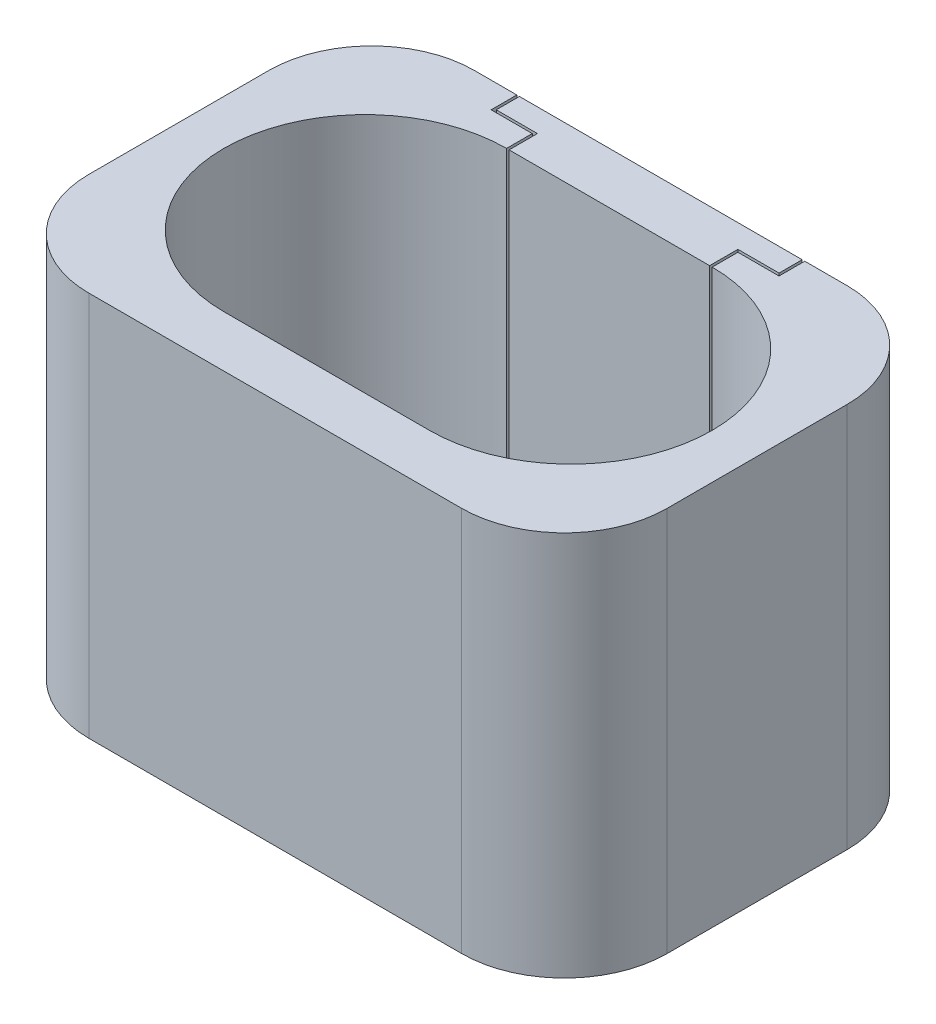
ISO-10303-21;
HEADER;
FILE_DESCRIPTION(('STEP AP214'),'2;1');
FILE_NAME('part.step','',(''),(''),'','','');
FILE_SCHEMA(('AUTOMOTIVE_DESIGN { 1 0 10303 214 1 1 1 1 }'));
ENDSEC;
DATA;
#1=APPLICATION_CONTEXT('core data for automotive mechanical design processes');
#2=APPLICATION_PROTOCOL_DEFINITION('international standard','automotive_design',2000,#1);
#3=PRODUCT_CONTEXT('',#1,'mechanical');
#4=PRODUCT('Part','Part','',(#3));
#5=PRODUCT_RELATED_PRODUCT_CATEGORY('part','',(#4));
#6=PRODUCT_DEFINITION_FORMATION('','',#4);
#7=PRODUCT_DEFINITION_CONTEXT('part definition',#1,'design');
#8=PRODUCT_DEFINITION('design','',#6,#7);
#9=PRODUCT_DEFINITION_SHAPE('','',#8);
#10=(LENGTH_UNIT() NAMED_UNIT(*) SI_UNIT(.MILLI.,.METRE.));
#11=(NAMED_UNIT(*) PLANE_ANGLE_UNIT() SI_UNIT($,.RADIAN.));
#12=(NAMED_UNIT(*) SI_UNIT($,.STERADIAN.) SOLID_ANGLE_UNIT());
#13=UNCERTAINTY_MEASURE_WITH_UNIT(LENGTH_MEASURE(1.E-05),#10,'distance_accuracy_value','');
#14=(GEOMETRIC_REPRESENTATION_CONTEXT(3) GLOBAL_UNCERTAINTY_ASSIGNED_CONTEXT((#13)) GLOBAL_UNIT_ASSIGNED_CONTEXT((#10,
#11,#12)) REPRESENTATION_CONTEXT('',''));
#15=CARTESIAN_POINT('',(0.,0.,0.));
#16=DIRECTION('',(0.,0.,1.));
#17=DIRECTION('',(1.,0.,0.));
#18=AXIS2_PLACEMENT_3D('',#15,#16,#17);
#19=CARTESIAN_POINT('',(-15.15,-7.5,-13.));
#20=DIRECTION('',(0.,0.,1.));
#21=DIRECTION('',(1.,0.,0.));
#22=AXIS2_PLACEMENT_3D('',#19,#20,#21);
#23=PLANE('',#22);
#24=DIRECTION('',(1.,0.,0.));
#25=VECTOR('',#24,1.);
#26=CARTESIAN_POINT('',(-15.15,7.5,-13.));
#27=LINE('',#26,#25);
#28=CARTESIAN_POINT('',(-15.15,7.5,-13.));
#29=VERTEX_POINT('',#28);
#30=CARTESIAN_POINT('',(-7.35,7.5,-13.));
#31=VERTEX_POINT('',#30);
#32=EDGE_CURVE('E124',#29,#31,#27,.T.);
#33=ORIENTED_EDGE('',*,*,#32,.F.);
#34=DIRECTION('',(0.,1.,0.));
#35=VECTOR('',#34,1.);
#36=CARTESIAN_POINT('',(-15.15,-7.5,-13.));
#37=LINE('',#36,#35);
#38=CARTESIAN_POINT('',(-15.15,-7.5,-13.));
#39=VERTEX_POINT('',#38);
#40=EDGE_CURVE('E12',#39,#29,#37,.T.);
#41=ORIENTED_EDGE('',*,*,#40,.F.);
#42=DIRECTION('',(1.,0.,0.));
#43=VECTOR('',#42,1.);
#44=CARTESIAN_POINT('',(-15.15,-7.5,-13.));
#45=LINE('',#44,#43);
#46=CARTESIAN_POINT('',(-7.35,-7.5,-13.));
#47=VERTEX_POINT('',#46);
#48=EDGE_CURVE('E163',#39,#47,#45,.T.);
#49=ORIENTED_EDGE('',*,*,#48,.T.);
#50=DIRECTION('',(0.,1.,0.));
#51=VECTOR('',#50,1.);
#52=CARTESIAN_POINT('',(-7.35,-7.5,-13.));
#53=LINE('',#52,#51);
#54=EDGE_CURVE('E151',#47,#31,#53,.T.);
#55=ORIENTED_EDGE('',*,*,#54,.T.);
#56=EDGE_LOOP('',(#33,#41,#49,#55));
#57=FACE_BOUND('',#56,.T.);
#58=ADVANCED_FACE('F47',(#57),#23,.T.);
#59=CARTESIAN_POINT('',(-15.15,-7.5,-14.1));
#60=DIRECTION('',(-1.,0.,0.));
#61=DIRECTION('',(0.,0.,1.));
#62=AXIS2_PLACEMENT_3D('',#59,#60,#61);
#63=PLANE('',#62);
#64=DIRECTION('',(0.,0.,1.));
#65=VECTOR('',#64,1.);
#66=CARTESIAN_POINT('',(-15.15,7.5,-14.1));
#67=LINE('',#66,#65);
#68=CARTESIAN_POINT('',(-15.15,7.5,-14.1));
#69=VERTEX_POINT('',#68);
#70=EDGE_CURVE('E172',#69,#29,#67,.T.);
#71=ORIENTED_EDGE('',*,*,#70,.F.);
#72=DIRECTION('',(0.,1.,0.));
#73=VECTOR('',#72,1.);
#74=CARTESIAN_POINT('',(-15.15,-7.5,-14.1));
#75=LINE('',#74,#73);
#76=CARTESIAN_POINT('',(-15.15,-7.5,-14.1));
#77=VERTEX_POINT('',#76);
#78=EDGE_CURVE('E57',#77,#69,#75,.T.);
#79=ORIENTED_EDGE('',*,*,#78,.F.);
#80=DIRECTION('',(0.,0.,1.));
#81=VECTOR('',#80,1.);
#82=CARTESIAN_POINT('',(-15.15,-7.5,-14.1));
#83=LINE('',#82,#81);
#84=EDGE_CURVE('E161',#77,#39,#83,.T.);
#85=ORIENTED_EDGE('',*,*,#84,.T.);
#86=ORIENTED_EDGE('',*,*,#40,.T.);
#87=EDGE_LOOP('',(#71,#79,#85,#86));
#88=FACE_BOUND('',#87,.T.);
#89=ADVANCED_FACE('F192',(#88),#63,.T.);
#90=CARTESIAN_POINT('',(-16.75,-7.5,-14.1));
#91=DIRECTION('',(0.,0.,1.));
#92=DIRECTION('',(1.,0.,0.));
#93=AXIS2_PLACEMENT_3D('',#90,#91,#92);
#94=PLANE('',#93);
#95=DIRECTION('',(1.,0.,0.));
#96=VECTOR('',#95,1.);
#97=CARTESIAN_POINT('',(-16.75,7.5,-14.1));
#98=LINE('',#97,#96);
#99=CARTESIAN_POINT('',(-16.75,7.5,-14.1));
#100=VERTEX_POINT('',#99);
#101=EDGE_CURVE('E169',#100,#69,#98,.T.);
#102=ORIENTED_EDGE('',*,*,#101,.F.);
#103=DIRECTION('',(0.,1.,0.));
#104=VECTOR('',#103,1.);
#105=CARTESIAN_POINT('',(-16.75,-7.5,-14.1));
#106=LINE('',#105,#104);
#107=CARTESIAN_POINT('',(-16.75,-7.5,-14.1));
#108=VERTEX_POINT('',#107);
#109=EDGE_CURVE('E175',#108,#100,#106,.T.);
#110=ORIENTED_EDGE('',*,*,#109,.F.);
#111=DIRECTION('',(1.,0.,0.));
#112=VECTOR('',#111,1.);
#113=CARTESIAN_POINT('',(-16.75,-7.5,-14.1));
#114=LINE('',#113,#112);
#115=EDGE_CURVE('E159',#108,#77,#114,.T.);
#116=ORIENTED_EDGE('',*,*,#115,.T.);
#117=ORIENTED_EDGE('',*,*,#78,.T.);
#118=EDGE_LOOP('',(#102,#110,#116,#117));
#119=FACE_BOUND('',#118,.T.);
#120=ADVANCED_FACE('F193',(#119),#94,.T.);
#121=CARTESIAN_POINT('',(-16.75,-7.5,-15.));
#122=DIRECTION('',(-1.,0.,0.));
#123=DIRECTION('',(0.,0.,1.));
#124=AXIS2_PLACEMENT_3D('',#121,#122,#123);
#125=PLANE('',#124);
#126=DIRECTION('',(0.,0.,1.));
#127=VECTOR('',#126,1.);
#128=CARTESIAN_POINT('',(-16.75,7.5,-15.));
#129=LINE('',#128,#127);
#130=CARTESIAN_POINT('',(-16.75,7.5,-15.));
#131=VERTEX_POINT('',#130);
#132=EDGE_CURVE('E166',#131,#100,#129,.T.);
#133=ORIENTED_EDGE('',*,*,#132,.F.);
#134=DIRECTION('',(0.,1.,0.));
#135=VECTOR('',#134,1.);
#136=CARTESIAN_POINT('',(-16.75,-7.5,-15.));
#137=LINE('',#136,#135);
#138=CARTESIAN_POINT('',(-16.75,-7.5,-15.));
#139=VERTEX_POINT('',#138);
#140=EDGE_CURVE('E51',#139,#131,#137,.T.);
#141=ORIENTED_EDGE('',*,*,#140,.F.);
#142=DIRECTION('',(0.,0.,1.));
#143=VECTOR('',#142,1.);
#144=CARTESIAN_POINT('',(-16.75,-7.5,-15.));
#145=LINE('',#144,#143);
#146=EDGE_CURVE('E123',#139,#108,#145,.T.);
#147=ORIENTED_EDGE('',*,*,#146,.T.);
#148=ORIENTED_EDGE('',*,*,#109,.T.);
#149=EDGE_LOOP('',(#133,#141,#147,#148));
#150=FACE_BOUND('',#149,.T.);
#151=ADVANCED_FACE('F178',(#150),#125,.T.);
#152=CARTESIAN_POINT('',(-15.15,-7.5,-15.));
#153=DIRECTION('',(0.,0.,-1.));
#154=DIRECTION('',(-1.,0.,0.));
#155=AXIS2_PLACEMENT_3D('',#152,#153,#154);
#156=PLANE('',#155);
#157=DIRECTION('',(-1.,0.,0.));
#158=VECTOR('',#157,1.);
#159=CARTESIAN_POINT('',(-15.15,7.5,-15.));
#160=LINE('',#159,#158);
#161=CARTESIAN_POINT('',(-5.75000000000001,7.5,-15.));
#162=VERTEX_POINT('',#161);
#163=EDGE_CURVE('E129',#162,#131,#160,.T.);
#164=ORIENTED_EDGE('',*,*,#163,.F.);
#165=DIRECTION('',(0.,1.,0.));
#166=VECTOR('',#165,1.);
#167=CARTESIAN_POINT('',(-5.75000000000001,-7.5,-15.));
#168=LINE('',#167,#166);
#169=CARTESIAN_POINT('',(-5.75000000000001,-7.5,-15.));
#170=VERTEX_POINT('',#169);
#171=EDGE_CURVE('E127',#170,#162,#168,.T.);
#172=ORIENTED_EDGE('',*,*,#171,.F.);
#173=DIRECTION('',(-1.,0.,0.));
#174=VECTOR('',#173,1.);
#175=CARTESIAN_POINT('',(-11.25,-7.5,-15.));
#176=LINE('',#175,#174);
#177=EDGE_CURVE('E91',#170,#139,#176,.T.);
#178=ORIENTED_EDGE('',*,*,#177,.T.);
#179=ORIENTED_EDGE('',*,*,#140,.T.);
#180=EDGE_LOOP('',(#164,#172,#178,#179));
#181=FACE_BOUND('',#180,.T.);
#182=ADVANCED_FACE('F49',(#181),#156,.T.);
#183=CARTESIAN_POINT('',(0.,-7.5,0.));
#184=DIRECTION('',(0.,1.,0.));
#185=DIRECTION('',(0.,0.,1.));
#186=AXIS2_PLACEMENT_3D('',#183,#184,#185);
#187=PLANE('',#186);
#188=ORIENTED_EDGE('',*,*,#177,.F.);
#189=DIRECTION('',(0.,0.,1.));
#190=VECTOR('',#189,1.);
#191=CARTESIAN_POINT('',(-5.75000000000001,-7.5,-15.));
#192=LINE('',#191,#190);
#193=CARTESIAN_POINT('',(-5.75000000000001,-7.5,-14.1));
#194=VERTEX_POINT('',#193);
#195=EDGE_CURVE('E119',#170,#194,#192,.T.);
#196=ORIENTED_EDGE('',*,*,#195,.T.);
#197=DIRECTION('',(-1.,0.,0.));
#198=VECTOR('',#197,1.);
#199=CARTESIAN_POINT('',(-5.75000000000001,-7.5,-14.1));
#200=LINE('',#199,#198);
#201=CARTESIAN_POINT('',(-7.35,-7.5,-14.1));
#202=VERTEX_POINT('',#201);
#203=EDGE_CURVE('E138',#194,#202,#200,.T.);
#204=ORIENTED_EDGE('',*,*,#203,.T.);
#205=DIRECTION('',(0.,0.,1.));
#206=VECTOR('',#205,1.);
#207=CARTESIAN_POINT('',(-7.35,-7.5,-14.1));
#208=LINE('',#207,#206);
#209=EDGE_CURVE('E133',#202,#47,#208,.T.);
#210=ORIENTED_EDGE('',*,*,#209,.T.);
#211=ORIENTED_EDGE('',*,*,#48,.F.);
#212=ORIENTED_EDGE('',*,*,#84,.F.);
#213=ORIENTED_EDGE('',*,*,#115,.F.);
#214=ORIENTED_EDGE('',*,*,#146,.F.);
#215=EDGE_LOOP('',(#188,#196,#204,#210,#211,#212,#213,#214));
#216=FACE_BOUND('',#215,.T.);
#217=ADVANCED_FACE('F117',(#216),#187,.F.);
#218=CARTESIAN_POINT('',(0.,7.5,0.));
#219=DIRECTION('',(0.,1.,0.));
#220=DIRECTION('',(0.,0.,1.));
#221=AXIS2_PLACEMENT_3D('',#218,#219,#220);
#222=PLANE('',#221);
#223=ORIENTED_EDGE('',*,*,#32,.T.);
#224=DIRECTION('',(0.,0.,1.));
#225=VECTOR('',#224,1.);
#226=CARTESIAN_POINT('',(-7.35,7.5,-14.1));
#227=LINE('',#226,#225);
#228=CARTESIAN_POINT('',(-7.35,7.5,-14.1));
#229=VERTEX_POINT('',#228);
#230=EDGE_CURVE('E139',#229,#31,#227,.T.);
#231=ORIENTED_EDGE('',*,*,#230,.F.);
#232=DIRECTION('',(-1.,0.,0.));
#233=VECTOR('',#232,1.);
#234=CARTESIAN_POINT('',(-5.75000000000001,7.5,-14.1));
#235=LINE('',#234,#233);
#236=CARTESIAN_POINT('',(-5.75000000000001,7.5,-14.1));
#237=VERTEX_POINT('',#236);
#238=EDGE_CURVE('E143',#237,#229,#235,.T.);
#239=ORIENTED_EDGE('',*,*,#238,.F.);
#240=DIRECTION('',(0.,0.,1.));
#241=VECTOR('',#240,1.);
#242=CARTESIAN_POINT('',(-5.75000000000001,7.5,-15.));
#243=LINE('',#242,#241);
#244=EDGE_CURVE('E148',#162,#237,#243,.T.);
#245=ORIENTED_EDGE('',*,*,#244,.F.);
#246=ORIENTED_EDGE('',*,*,#163,.T.);
#247=ORIENTED_EDGE('',*,*,#132,.T.);
#248=ORIENTED_EDGE('',*,*,#101,.T.);
#249=ORIENTED_EDGE('',*,*,#70,.T.);
#250=EDGE_LOOP('',(#223,#231,#239,#245,#246,#247,#248,#249));
#251=FACE_BOUND('',#250,.T.);
#252=ADVANCED_FACE('F180',(#251),#222,.T.);
#253=CARTESIAN_POINT('',(-7.35,-7.5,-14.1));
#254=DIRECTION('',(1.,0.,0.));
#255=DIRECTION('',(0.,0.,1.));
#256=AXIS2_PLACEMENT_3D('',#253,#254,#255);
#257=PLANE('',#256);
#258=ORIENTED_EDGE('',*,*,#230,.T.);
#259=ORIENTED_EDGE('',*,*,#54,.F.);
#260=ORIENTED_EDGE('',*,*,#209,.F.);
#261=DIRECTION('',(0.,1.,0.));
#262=VECTOR('',#261,1.);
#263=CARTESIAN_POINT('',(-7.35,-7.5,-14.1));
#264=LINE('',#263,#262);
#265=EDGE_CURVE('E154',#202,#229,#264,.T.);
#266=ORIENTED_EDGE('',*,*,#265,.T.);
#267=EDGE_LOOP('',(#258,#259,#260,#266));
#268=FACE_BOUND('',#267,.T.);
#269=ADVANCED_FACE('F191',(#268),#257,.T.);
#270=CARTESIAN_POINT('',(-5.75000000000001,-7.5,-14.1));
#271=DIRECTION('',(0.,0.,1.));
#272=DIRECTION('',(-1.,0.,0.));
#273=AXIS2_PLACEMENT_3D('',#270,#271,#272);
#274=PLANE('',#273);
#275=ORIENTED_EDGE('',*,*,#238,.T.);
#276=ORIENTED_EDGE('',*,*,#265,.F.);
#277=ORIENTED_EDGE('',*,*,#203,.F.);
#278=DIRECTION('',(0.,1.,0.));
#279=VECTOR('',#278,1.);
#280=CARTESIAN_POINT('',(-5.75000000000001,-7.5,-14.1));
#281=LINE('',#280,#279);
#282=EDGE_CURVE('E132',#194,#237,#281,.T.);
#283=ORIENTED_EDGE('',*,*,#282,.T.);
#284=EDGE_LOOP('',(#275,#276,#277,#283));
#285=FACE_BOUND('',#284,.T.);
#286=ADVANCED_FACE('F184',(#285),#274,.T.);
#287=CARTESIAN_POINT('',(-5.75000000000001,-7.5,-15.));
#288=DIRECTION('',(1.,0.,0.));
#289=DIRECTION('',(0.,0.,1.));
#290=AXIS2_PLACEMENT_3D('',#287,#288,#289);
#291=PLANE('',#290);
#292=ORIENTED_EDGE('',*,*,#244,.T.);
#293=ORIENTED_EDGE('',*,*,#282,.F.);
#294=ORIENTED_EDGE('',*,*,#195,.F.);
#295=ORIENTED_EDGE('',*,*,#171,.T.);
#296=EDGE_LOOP('',(#292,#293,#294,#295));
#297=FACE_BOUND('',#296,.T.);
#298=ADVANCED_FACE('F135',(#297),#291,.T.);
#299=CLOSED_SHELL('',(#58,#89,#120,#151,#182,#217,#252,#269,#286,#298));
#300=MANIFOLD_SOLID_BREP('B2',#299);
#301=CARTESIAN_POINT('',(-22.5,7.5,-15.));
#302=DIRECTION('',(0.,0.,1.));
#303=DIRECTION('',(1.,0.,0.));
#304=AXIS2_PLACEMENT_3D('',#301,#302,#303);
#305=PLANE('',#304);
#306=DIRECTION('',(-1.,0.,0.));
#307=VECTOR('',#306,1.);
#308=CARTESIAN_POINT('',(-22.5,7.5,-15.));
#309=LINE('',#308,#307);
#310=CARTESIAN_POINT('',(-4.00000000000001,7.5,-15.));
#311=VERTEX_POINT('',#310);
#312=CARTESIAN_POINT('',(-5.65000000000001,7.5,-15.));
#313=VERTEX_POINT('',#312);
#314=EDGE_CURVE('E513',#311,#313,#309,.T.);
#315=ORIENTED_EDGE('',*,*,#314,.F.);
#316=DIRECTION('',(0.,-1.,0.));
#317=VECTOR('',#316,1.);
#318=CARTESIAN_POINT('',(-4.,7.5,-15.));
#319=LINE('',#318,#317);
#320=CARTESIAN_POINT('',(-4.00000000000001,-7.5,-15.));
#321=VERTEX_POINT('',#320);
#322=EDGE_CURVE('E517',#311,#321,#319,.T.);
#323=ORIENTED_EDGE('',*,*,#322,.T.);
#324=DIRECTION('',(-1.,0.,0.));
#325=VECTOR('',#324,1.);
#326=CARTESIAN_POINT('',(-22.5,-7.5,-15.));
#327=LINE('',#326,#325);
#328=CARTESIAN_POINT('',(-5.65000000000001,-7.5,-15.));
#329=VERTEX_POINT('',#328);
#330=EDGE_CURVE('E523',#321,#329,#327,.T.);
#331=ORIENTED_EDGE('',*,*,#330,.T.);
#332=DIRECTION('',(0.,1.,0.));
#333=VECTOR('',#332,1.);
#334=CARTESIAN_POINT('',(-5.65000000000001,-7.5,-15.));
#335=LINE('',#334,#333);
#336=EDGE_CURVE('E426',#329,#313,#335,.T.);
#337=ORIENTED_EDGE('',*,*,#336,.T.);
#338=EDGE_LOOP('',(#315,#323,#331,#337));
#339=FACE_BOUND('',#338,.T.);
#340=ADVANCED_FACE('F293',(#339),#305,.F.);
#341=CARTESIAN_POINT('',(0.,7.5,0.));
#342=DIRECTION('',(0.,-1.,0.));
#343=DIRECTION('',(0.,0.,-1.));
#344=AXIS2_PLACEMENT_3D('',#341,#342,#343);
#345=PLANE('',#344);
#346=DIRECTION('',(0.,0.,-1.));
#347=VECTOR('',#346,1.);
#348=CARTESIAN_POINT('',(0.,7.5,-15.));
#349=LINE('',#348,#347);
#350=CARTESIAN_POINT('',(0.,7.5,-4.));
#351=VERTEX_POINT('',#350);
#352=CARTESIAN_POINT('',(0.,7.5,-11.));
#353=VERTEX_POINT('',#352);
#354=EDGE_CURVE('E508',#351,#353,#349,.T.);
#355=ORIENTED_EDGE('',*,*,#354,.T.);
#356=CARTESIAN_POINT('',(-4.,7.5,-11.));
#357=DIRECTION('',(0.,-1.,0.));
#358=DIRECTION('',(0.,0.,-1.));
#359=AXIS2_PLACEMENT_3D('',#356,#357,#358);
#360=CIRCLE('',#359,4.);
#361=EDGE_CURVE('E547',#353,#311,#360,.F.);
#362=ORIENTED_EDGE('',*,*,#361,.T.);
#363=ORIENTED_EDGE('',*,*,#314,.T.);
#364=DIRECTION('',(0.,0.,1.));
#365=VECTOR('',#364,1.);
#366=CARTESIAN_POINT('',(-5.65000000000001,7.5,-15.));
#367=LINE('',#366,#365);
#368=CARTESIAN_POINT('',(-5.65000000000001,7.5,-14.));
#369=VERTEX_POINT('',#368);
#370=EDGE_CURVE('E444',#313,#369,#367,.T.);
#371=ORIENTED_EDGE('',*,*,#370,.T.);
#372=DIRECTION('',(-1.,0.,0.));
#373=VECTOR('',#372,1.);
#374=CARTESIAN_POINT('',(-7.25000000000001,7.5,-14.));
#375=LINE('',#374,#373);
#376=CARTESIAN_POINT('',(-7.25000000000001,7.5,-14.));
#377=VERTEX_POINT('',#376);
#378=EDGE_CURVE('E437',#369,#377,#375,.T.);
#379=ORIENTED_EDGE('',*,*,#378,.T.);
#380=DIRECTION('',(0.,0.,-1.));
#381=VECTOR('',#380,1.);
#382=CARTESIAN_POINT('',(-7.25,7.5,0.000999999999999265));
#383=LINE('',#382,#381);
#384=CARTESIAN_POINT('',(-7.25,7.5,-13.));
#385=VERTEX_POINT('',#384);
#386=EDGE_CURVE('E469',#385,#377,#383,.T.);
#387=ORIENTED_EDGE('',*,*,#386,.F.);
#388=CARTESIAN_POINT('',(-7.25,7.5,-7.5));
#389=DIRECTION('',(0.,1.,0.));
#390=DIRECTION('',(0.,0.,1.));
#391=AXIS2_PLACEMENT_3D('',#388,#389,#390);
#392=CIRCLE('',#391,5.5);
#393=CARTESIAN_POINT('',(-7.25,7.5,-2.));
#394=VERTEX_POINT('',#393);
#395=EDGE_CURVE('E484',#394,#385,#392,.T.);
#396=ORIENTED_EDGE('',*,*,#395,.F.);
#397=DIRECTION('',(1.,0.,0.));
#398=VECTOR('',#397,1.);
#399=CARTESIAN_POINT('',(-15.25,7.5,-2.));
#400=LINE('',#399,#398);
#401=CARTESIAN_POINT('',(-15.25,7.5,-2.));
#402=VERTEX_POINT('',#401);
#403=EDGE_CURVE('E491',#402,#394,#400,.T.);
#404=ORIENTED_EDGE('',*,*,#403,.F.);
#405=CARTESIAN_POINT('',(-15.25,7.5,-7.5));
#406=DIRECTION('',(0.,1.,0.));
#407=DIRECTION('',(0.,0.,1.));
#408=AXIS2_PLACEMENT_3D('',#405,#406,#407);
#409=CIRCLE('',#408,5.5);
#410=CARTESIAN_POINT('',(-15.25,7.5,-13.));
#411=VERTEX_POINT('',#410);
#412=EDGE_CURVE('E472',#411,#402,#409,.T.);
#413=ORIENTED_EDGE('',*,*,#412,.F.);
#414=DIRECTION('',(0.,0.,-1.));
#415=VECTOR('',#414,1.);
#416=CARTESIAN_POINT('',(-15.25,7.5,0.000999999999999265));
#417=LINE('',#416,#415);
#418=CARTESIAN_POINT('',(-15.25,7.5,-14.));
#419=VERTEX_POINT('',#418);
#420=EDGE_CURVE('E473',#411,#419,#417,.T.);
#421=ORIENTED_EDGE('',*,*,#420,.T.);
#422=DIRECTION('',(1.,0.,0.));
#423=VECTOR('',#422,1.);
#424=CARTESIAN_POINT('',(-15.25,7.5,-14.));
#425=LINE('',#424,#423);
#426=CARTESIAN_POINT('',(-16.85,7.5,-14.));
#427=VERTEX_POINT('',#426);
#428=EDGE_CURVE('E456',#427,#419,#425,.T.);
#429=ORIENTED_EDGE('',*,*,#428,.F.);
#430=DIRECTION('',(0.,0.,1.));
#431=VECTOR('',#430,1.);
#432=CARTESIAN_POINT('',(-16.85,7.5,-15.));
#433=LINE('',#432,#431);
#434=CARTESIAN_POINT('',(-16.85,7.5,-15.));
#435=VERTEX_POINT('',#434);
#436=EDGE_CURVE('E449',#435,#427,#433,.T.);
#437=ORIENTED_EDGE('',*,*,#436,.F.);
#438=CARTESIAN_POINT('',(-18.5,7.5,-15.));
#439=VERTEX_POINT('',#438);
#440=EDGE_CURVE('E512',#435,#439,#309,.T.);
#441=ORIENTED_EDGE('',*,*,#440,.T.);
#442=CARTESIAN_POINT('',(-18.5,7.5,-11.));
#443=DIRECTION('',(0.,-1.,0.));
#444=DIRECTION('',(0.,0.,-1.));
#445=AXIS2_PLACEMENT_3D('',#442,#443,#444);
#446=CIRCLE('',#445,4.);
#447=CARTESIAN_POINT('',(-22.5,7.5,-11.));
#448=VERTEX_POINT('',#447);
#449=EDGE_CURVE('E542',#439,#448,#446,.F.);
#450=ORIENTED_EDGE('',*,*,#449,.T.);
#451=DIRECTION('',(0.,0.,1.));
#452=VECTOR('',#451,1.);
#453=CARTESIAN_POINT('',(-22.5,7.5,-15.));
#454=LINE('',#453,#452);
#455=CARTESIAN_POINT('',(-22.5,7.5,-4.));
#456=VERTEX_POINT('',#455);
#457=EDGE_CURVE('E515',#448,#456,#454,.T.);
#458=ORIENTED_EDGE('',*,*,#457,.T.);
#459=CARTESIAN_POINT('',(-18.5,7.5,-4.));
#460=DIRECTION('',(0.,-1.,0.));
#461=DIRECTION('',(0.,0.,-1.));
#462=AXIS2_PLACEMENT_3D('',#459,#460,#461);
#463=CIRCLE('',#462,4.);
#464=CARTESIAN_POINT('',(-18.5,7.5,0.));
#465=VERTEX_POINT('',#464);
#466=EDGE_CURVE('E315',#456,#465,#463,.F.);
#467=ORIENTED_EDGE('',*,*,#466,.T.);
#468=DIRECTION('',(1.,0.,0.));
#469=VECTOR('',#468,1.);
#470=CARTESIAN_POINT('',(-22.5,7.5,0.));
#471=LINE('',#470,#469);
#472=CARTESIAN_POINT('',(-4.00000000000001,7.5,0.));
#473=VERTEX_POINT('',#472);
#474=EDGE_CURVE('E506',#465,#473,#471,.T.);
#475=ORIENTED_EDGE('',*,*,#474,.T.);
#476=CARTESIAN_POINT('',(-4.,7.5,-4.));
#477=DIRECTION('',(0.,-1.,0.));
#478=DIRECTION('',(0.,0.,-1.));
#479=AXIS2_PLACEMENT_3D('',#476,#477,#478);
#480=CIRCLE('',#479,4.);
#481=EDGE_CURVE('E545',#473,#351,#480,.F.);
#482=ORIENTED_EDGE('',*,*,#481,.T.);
#483=EDGE_LOOP('',(#355,#362,#363,#371,#379,#387,#396,#404,#413,#421,#429,#437,#441,#450,#458,
#467,#475,#482));
#484=FACE_BOUND('',#483,.T.);
#485=ADVANCED_FACE('F562',(#484),#345,.F.);
#486=CARTESIAN_POINT('',(0.,-7.5,0.));
#487=DIRECTION('',(0.,-1.,0.));
#488=DIRECTION('',(0.,0.,-1.));
#489=AXIS2_PLACEMENT_3D('',#486,#487,#488);
#490=PLANE('',#489);
#491=ORIENTED_EDGE('',*,*,#330,.F.);
#492=CARTESIAN_POINT('',(-4.,-7.5,-11.));
#493=DIRECTION('',(0.,-1.,0.));
#494=DIRECTION('',(0.,0.,-1.));
#495=AXIS2_PLACEMENT_3D('',#492,#493,#494);
#496=CIRCLE('',#495,4.);
#497=CARTESIAN_POINT('',(0.,-7.5,-11.));
#498=VERTEX_POINT('',#497);
#499=EDGE_CURVE('E535',#321,#498,#496,.T.);
#500=ORIENTED_EDGE('',*,*,#499,.T.);
#501=DIRECTION('',(0.,0.,-1.));
#502=VECTOR('',#501,1.);
#503=CARTESIAN_POINT('',(0.,-7.5,-15.));
#504=LINE('',#503,#502);
#505=CARTESIAN_POINT('',(0.,-7.5,-4.));
#506=VERTEX_POINT('',#505);
#507=EDGE_CURVE('E519',#506,#498,#504,.T.);
#508=ORIENTED_EDGE('',*,*,#507,.F.);
#509=CARTESIAN_POINT('',(-4.,-7.5,-4.));
#510=DIRECTION('',(0.,-1.,0.));
#511=DIRECTION('',(0.,0.,-1.));
#512=AXIS2_PLACEMENT_3D('',#509,#510,#511);
#513=CIRCLE('',#512,4.);
#514=CARTESIAN_POINT('',(-4.00000000000001,-7.5,0.));
#515=VERTEX_POINT('',#514);
#516=EDGE_CURVE('E533',#506,#515,#513,.T.);
#517=ORIENTED_EDGE('',*,*,#516,.T.);
#518=DIRECTION('',(1.,0.,0.));
#519=VECTOR('',#518,1.);
#520=CARTESIAN_POINT('',(-22.5,-7.5,0.));
#521=LINE('',#520,#519);
#522=CARTESIAN_POINT('',(-18.5,-7.5,0.));
#523=VERTEX_POINT('',#522);
#524=EDGE_CURVE('E499',#523,#515,#521,.T.);
#525=ORIENTED_EDGE('',*,*,#524,.F.);
#526=CARTESIAN_POINT('',(-18.5,-7.5,-4.));
#527=DIRECTION('',(0.,-1.,0.));
#528=DIRECTION('',(0.,0.,-1.));
#529=AXIS2_PLACEMENT_3D('',#526,#527,#528);
#530=CIRCLE('',#529,4.);
#531=CARTESIAN_POINT('',(-22.5,-7.5,-4.));
#532=VERTEX_POINT('',#531);
#533=EDGE_CURVE('E531',#523,#532,#530,.T.);
#534=ORIENTED_EDGE('',*,*,#533,.T.);
#535=DIRECTION('',(0.,0.,1.));
#536=VECTOR('',#535,1.);
#537=CARTESIAN_POINT('',(-22.5,-7.5,-15.));
#538=LINE('',#537,#536);
#539=CARTESIAN_POINT('',(-22.5,-7.5,-11.));
#540=VERTEX_POINT('',#539);
#541=EDGE_CURVE('E509',#540,#532,#538,.T.);
#542=ORIENTED_EDGE('',*,*,#541,.F.);
#543=CARTESIAN_POINT('',(-18.5,-7.5,-11.));
#544=DIRECTION('',(0.,-1.,0.));
#545=DIRECTION('',(0.,0.,-1.));
#546=AXIS2_PLACEMENT_3D('',#543,#544,#545);
#547=CIRCLE('',#546,4.);
#548=CARTESIAN_POINT('',(-18.5,-7.5,-15.));
#549=VERTEX_POINT('',#548);
#550=EDGE_CURVE('E529',#540,#549,#547,.T.);
#551=ORIENTED_EDGE('',*,*,#550,.T.);
#552=CARTESIAN_POINT('',(-16.85,-7.5,-15.));
#553=VERTEX_POINT('',#552);
#554=EDGE_CURVE('E522',#553,#549,#327,.T.);
#555=ORIENTED_EDGE('',*,*,#554,.F.);
#556=DIRECTION('',(0.,0.,1.));
#557=VECTOR('',#556,1.);
#558=CARTESIAN_POINT('',(-16.85,-7.5,-15.));
#559=LINE('',#558,#557);
#560=CARTESIAN_POINT('',(-16.85,-7.5,-14.));
#561=VERTEX_POINT('',#560);
#562=EDGE_CURVE('E452',#553,#561,#559,.T.);
#563=ORIENTED_EDGE('',*,*,#562,.T.);
#564=DIRECTION('',(1.,0.,0.));
#565=VECTOR('',#564,1.);
#566=CARTESIAN_POINT('',(-15.25,-7.5,-14.));
#567=LINE('',#566,#565);
#568=CARTESIAN_POINT('',(-15.25,-7.5,-14.));
#569=VERTEX_POINT('',#568);
#570=EDGE_CURVE('E455',#561,#569,#567,.T.);
#571=ORIENTED_EDGE('',*,*,#570,.T.);
#572=DIRECTION('',(0.,0.,-1.));
#573=VECTOR('',#572,1.);
#574=CARTESIAN_POINT('',(-15.25,-7.5,0.000999999999999265));
#575=LINE('',#574,#573);
#576=CARTESIAN_POINT('',(-15.25,-7.5,-13.));
#577=VERTEX_POINT('',#576);
#578=EDGE_CURVE('E476',#577,#569,#575,.T.);
#579=ORIENTED_EDGE('',*,*,#578,.F.);
#580=CARTESIAN_POINT('',(-15.25,-7.5,-7.5));
#581=DIRECTION('',(0.,1.,0.));
#582=DIRECTION('',(0.,0.,1.));
#583=AXIS2_PLACEMENT_3D('',#580,#581,#582);
#584=CIRCLE('',#583,5.5);
#585=CARTESIAN_POINT('',(-15.25,-7.5,-2.));
#586=VERTEX_POINT('',#585);
#587=EDGE_CURVE('E480',#577,#586,#584,.T.);
#588=ORIENTED_EDGE('',*,*,#587,.T.);
#589=DIRECTION('',(1.,0.,0.));
#590=VECTOR('',#589,1.);
#591=CARTESIAN_POINT('',(-15.25,-7.5,-2.));
#592=LINE('',#591,#590);
#593=CARTESIAN_POINT('',(-7.25,-7.5,-2.));
#594=VERTEX_POINT('',#593);
#595=EDGE_CURVE('E483',#586,#594,#592,.T.);
#596=ORIENTED_EDGE('',*,*,#595,.T.);
#597=CARTESIAN_POINT('',(-7.25,-7.5,-7.5));
#598=DIRECTION('',(0.,1.,0.));
#599=DIRECTION('',(0.,0.,1.));
#600=AXIS2_PLACEMENT_3D('',#597,#598,#599);
#601=CIRCLE('',#600,5.5);
#602=CARTESIAN_POINT('',(-7.25,-7.5,-13.));
#603=VERTEX_POINT('',#602);
#604=EDGE_CURVE('E487',#594,#603,#601,.T.);
#605=ORIENTED_EDGE('',*,*,#604,.T.);
#606=DIRECTION('',(0.,0.,-1.));
#607=VECTOR('',#606,1.);
#608=CARTESIAN_POINT('',(-7.25,-7.5,0.000999999999999265));
#609=LINE('',#608,#607);
#610=CARTESIAN_POINT('',(-7.25,-7.5,-14.));
#611=VERTEX_POINT('',#610);
#612=EDGE_CURVE('E443',#603,#611,#609,.T.);
#613=ORIENTED_EDGE('',*,*,#612,.T.);
#614=DIRECTION('',(-1.,0.,0.));
#615=VECTOR('',#614,1.);
#616=CARTESIAN_POINT('',(-7.25000000000001,-7.5,-14.));
#617=LINE('',#616,#615);
#618=CARTESIAN_POINT('',(-5.65000000000001,-7.5,-14.));
#619=VERTEX_POINT('',#618);
#620=EDGE_CURVE('E431',#619,#611,#617,.T.);
#621=ORIENTED_EDGE('',*,*,#620,.F.);
#622=DIRECTION('',(0.,0.,1.));
#623=VECTOR('',#622,1.);
#624=CARTESIAN_POINT('',(-5.65000000000001,-7.5,-15.));
#625=LINE('',#624,#623);
#626=EDGE_CURVE('E419',#329,#619,#625,.T.);
#627=ORIENTED_EDGE('',*,*,#626,.F.);
#628=EDGE_LOOP('',(#491,#500,#508,#517,#525,#534,#542,#551,#555,#563,#571,#579,#588,#596,#605,
#613,#621,#627));
#629=FACE_BOUND('',#628,.T.);
#630=ADVANCED_FACE('F441',(#629),#490,.T.);
#631=CARTESIAN_POINT('',(-7.25,7.5,0.000999999999999265));
#632=DIRECTION('',(1.,0.,0.));
#633=DIRECTION('',(0.,1.,0.));
#634=AXIS2_PLACEMENT_3D('',#631,#632,#633);
#635=PLANE('',#634);
#636=DIRECTION('',(0.,1.,0.));
#637=VECTOR('',#636,1.);
#638=CARTESIAN_POINT('',(-7.25000000000001,-7.5,-14.));
#639=LINE('',#638,#637);
#640=EDGE_CURVE('E430',#611,#377,#639,.T.);
#641=ORIENTED_EDGE('',*,*,#640,.F.);
#642=ORIENTED_EDGE('',*,*,#612,.F.);
#643=DIRECTION('',(0.,1.,0.));
#644=VECTOR('',#643,1.);
#645=CARTESIAN_POINT('',(-7.25,-7.5,-13.));
#646=LINE('',#645,#644);
#647=EDGE_CURVE('E500',#603,#385,#646,.T.);
#648=ORIENTED_EDGE('',*,*,#647,.T.);
#649=ORIENTED_EDGE('',*,*,#386,.T.);
#650=EDGE_LOOP('',(#641,#642,#648,#649));
#651=FACE_BOUND('',#650,.T.);
#652=ADVANCED_FACE('F587',(#651),#635,.F.);
#653=CARTESIAN_POINT('',(-22.5,7.5,0.));
#654=DIRECTION('',(0.,0.,-1.));
#655=DIRECTION('',(-1.,0.,0.));
#656=AXIS2_PLACEMENT_3D('',#653,#654,#655);
#657=PLANE('',#656);
#658=ORIENTED_EDGE('',*,*,#524,.T.);
#659=DIRECTION('',(0.,-1.,0.));
#660=VECTOR('',#659,1.);
#661=CARTESIAN_POINT('',(-4.,7.5,0.));
#662=LINE('',#661,#660);
#663=EDGE_CURVE('E308',#515,#473,#662,.F.);
#664=ORIENTED_EDGE('',*,*,#663,.T.);
#665=ORIENTED_EDGE('',*,*,#474,.F.);
#666=DIRECTION('',(0.,-1.,0.));
#667=VECTOR('',#666,1.);
#668=CARTESIAN_POINT('',(-18.5,7.5,0.));
#669=LINE('',#668,#667);
#670=EDGE_CURVE('E549',#465,#523,#669,.T.);
#671=ORIENTED_EDGE('',*,*,#670,.T.);
#672=EDGE_LOOP('',(#658,#664,#665,#671));
#673=FACE_BOUND('',#672,.T.);
#674=ADVANCED_FACE('F568',(#673),#657,.F.);
#675=CARTESIAN_POINT('',(0.,7.5,-15.));
#676=DIRECTION('',(-1.,0.,0.));
#677=DIRECTION('',(0.,0.,1.));
#678=AXIS2_PLACEMENT_3D('',#675,#676,#677);
#679=PLANE('',#678);
#680=ORIENTED_EDGE('',*,*,#507,.T.);
#681=DIRECTION('',(0.,-1.,0.));
#682=VECTOR('',#681,1.);
#683=CARTESIAN_POINT('',(0.,7.5,-11.));
#684=LINE('',#683,#682);
#685=EDGE_CURVE('E540',#498,#353,#684,.F.);
#686=ORIENTED_EDGE('',*,*,#685,.T.);
#687=ORIENTED_EDGE('',*,*,#354,.F.);
#688=DIRECTION('',(0.,-1.,0.));
#689=VECTOR('',#688,1.);
#690=CARTESIAN_POINT('',(0.,7.5,-4.));
#691=LINE('',#690,#689);
#692=EDGE_CURVE('E537',#351,#506,#691,.T.);
#693=ORIENTED_EDGE('',*,*,#692,.T.);
#694=EDGE_LOOP('',(#680,#686,#687,#693));
#695=FACE_BOUND('',#694,.T.);
#696=ADVANCED_FACE('F576',(#695),#679,.F.);
#697=ORIENTED_EDGE('',*,*,#554,.T.);
#698=DIRECTION('',(0.,-1.,0.));
#699=VECTOR('',#698,1.);
#700=CARTESIAN_POINT('',(-18.5,7.5,-15.));
#701=LINE('',#700,#699);
#702=EDGE_CURVE('E45',#549,#439,#701,.F.);
#703=ORIENTED_EDGE('',*,*,#702,.T.);
#704=ORIENTED_EDGE('',*,*,#440,.F.);
#705=DIRECTION('',(0.,1.,0.));
#706=VECTOR('',#705,1.);
#707=CARTESIAN_POINT('',(-16.85,-7.5,-15.));
#708=LINE('',#707,#706);
#709=EDGE_CURVE('E459',#553,#435,#708,.T.);
#710=ORIENTED_EDGE('',*,*,#709,.F.);
#711=EDGE_LOOP('',(#697,#703,#704,#710));
#712=FACE_BOUND('',#711,.T.);
#713=ADVANCED_FACE('F614',(#712),#305,.F.);
#714=CARTESIAN_POINT('',(-22.5,7.5,-15.));
#715=DIRECTION('',(1.,0.,0.));
#716=DIRECTION('',(0.,0.,-1.));
#717=AXIS2_PLACEMENT_3D('',#714,#715,#716);
#718=PLANE('',#717);
#719=ORIENTED_EDGE('',*,*,#541,.T.);
#720=DIRECTION('',(0.,-1.,0.));
#721=VECTOR('',#720,1.);
#722=CARTESIAN_POINT('',(-22.5,7.5,-4.));
#723=LINE('',#722,#721);
#724=EDGE_CURVE('E301',#532,#456,#723,.F.);
#725=ORIENTED_EDGE('',*,*,#724,.T.);
#726=ORIENTED_EDGE('',*,*,#457,.F.);
#727=DIRECTION('',(0.,-1.,0.));
#728=VECTOR('',#727,1.);
#729=CARTESIAN_POINT('',(-22.5,7.5,-11.));
#730=LINE('',#729,#728);
#731=EDGE_CURVE('E553',#448,#540,#730,.T.);
#732=ORIENTED_EDGE('',*,*,#731,.T.);
#733=EDGE_LOOP('',(#719,#725,#726,#732));
#734=FACE_BOUND('',#733,.T.);
#735=ADVANCED_FACE('F558',(#734),#718,.F.);
#736=CARTESIAN_POINT('',(-15.25,-7.5,-7.5));
#737=DIRECTION('',(0.,1.,0.));
#738=DIRECTION('',(0.,0.,1.));
#739=AXIS2_PLACEMENT_3D('',#736,#737,#738);
#740=CYLINDRICAL_SURFACE('',#739,5.5);
#741=ORIENTED_EDGE('',*,*,#412,.T.);
#742=DIRECTION('',(0.,1.,0.));
#743=VECTOR('',#742,1.);
#744=CARTESIAN_POINT('',(-15.25,-7.5,-2.));
#745=LINE('',#744,#743);
#746=EDGE_CURVE('E489',#586,#402,#745,.T.);
#747=ORIENTED_EDGE('',*,*,#746,.F.);
#748=ORIENTED_EDGE('',*,*,#587,.F.);
#749=DIRECTION('',(0.,1.,0.));
#750=VECTOR('',#749,1.);
#751=CARTESIAN_POINT('',(-15.25,-7.5,-13.));
#752=LINE('',#751,#750);
#753=EDGE_CURVE('E496',#577,#411,#752,.T.);
#754=ORIENTED_EDGE('',*,*,#753,.T.);
#755=EDGE_LOOP('',(#741,#747,#748,#754));
#756=FACE_BOUND('',#755,.T.);
#757=ADVANCED_FACE('F601',(#756),#740,.F.);
#758=CARTESIAN_POINT('',(-7.25,-7.5,-7.5));
#759=DIRECTION('',(0.,1.,0.));
#760=DIRECTION('',(0.,0.,1.));
#761=AXIS2_PLACEMENT_3D('',#758,#759,#760);
#762=CYLINDRICAL_SURFACE('',#761,5.5);
#763=ORIENTED_EDGE('',*,*,#395,.T.);
#764=ORIENTED_EDGE('',*,*,#647,.F.);
#765=ORIENTED_EDGE('',*,*,#604,.F.);
#766=DIRECTION('',(0.,1.,0.));
#767=VECTOR('',#766,1.);
#768=CARTESIAN_POINT('',(-7.25,-7.5,-2.));
#769=LINE('',#768,#767);
#770=EDGE_CURVE('E502',#594,#394,#769,.T.);
#771=ORIENTED_EDGE('',*,*,#770,.T.);
#772=EDGE_LOOP('',(#763,#764,#765,#771));
#773=FACE_BOUND('',#772,.T.);
#774=ADVANCED_FACE('F590',(#773),#762,.F.);
#775=CARTESIAN_POINT('',(-15.25,-7.5,-2.));
#776=DIRECTION('',(0.,0.,1.));
#777=DIRECTION('',(1.,0.,0.));
#778=AXIS2_PLACEMENT_3D('',#775,#776,#777);
#779=PLANE('',#778);
#780=ORIENTED_EDGE('',*,*,#403,.T.);
#781=ORIENTED_EDGE('',*,*,#770,.F.);
#782=ORIENTED_EDGE('',*,*,#595,.F.);
#783=ORIENTED_EDGE('',*,*,#746,.T.);
#784=EDGE_LOOP('',(#780,#781,#782,#783));
#785=FACE_BOUND('',#784,.T.);
#786=ADVANCED_FACE('F596',(#785),#779,.F.);
#787=CARTESIAN_POINT('',(-15.25,7.5,0.000999999999999265));
#788=DIRECTION('',(-1.,0.,0.));
#789=DIRECTION('',(0.,-1.,0.));
#790=AXIS2_PLACEMENT_3D('',#787,#788,#789);
#791=PLANE('',#790);
#792=ORIENTED_EDGE('',*,*,#578,.T.);
#793=DIRECTION('',(0.,1.,0.));
#794=VECTOR('',#793,1.);
#795=CARTESIAN_POINT('',(-15.25,-7.5,-14.));
#796=LINE('',#795,#794);
#797=EDGE_CURVE('E463',#569,#419,#796,.T.);
#798=ORIENTED_EDGE('',*,*,#797,.T.);
#799=ORIENTED_EDGE('',*,*,#420,.F.);
#800=ORIENTED_EDGE('',*,*,#753,.F.);
#801=EDGE_LOOP('',(#792,#798,#799,#800));
#802=FACE_BOUND('',#801,.T.);
#803=ADVANCED_FACE('F603',(#802),#791,.F.);
#804=CARTESIAN_POINT('',(-15.25,-7.5,-14.));
#805=DIRECTION('',(0.,0.,1.));
#806=DIRECTION('',(1.,0.,0.));
#807=AXIS2_PLACEMENT_3D('',#804,#805,#806);
#808=PLANE('',#807);
#809=ORIENTED_EDGE('',*,*,#428,.T.);
#810=ORIENTED_EDGE('',*,*,#797,.F.);
#811=ORIENTED_EDGE('',*,*,#570,.F.);
#812=DIRECTION('',(0.,1.,0.));
#813=VECTOR('',#812,1.);
#814=CARTESIAN_POINT('',(-16.85,-7.5,-14.));
#815=LINE('',#814,#813);
#816=EDGE_CURVE('E466',#561,#427,#815,.T.);
#817=ORIENTED_EDGE('',*,*,#816,.T.);
#818=EDGE_LOOP('',(#809,#810,#811,#817));
#819=FACE_BOUND('',#818,.T.);
#820=ADVANCED_FACE('F607',(#819),#808,.F.);
#821=CARTESIAN_POINT('',(-16.85,-7.5,-15.));
#822=DIRECTION('',(-1.,0.,0.));
#823=DIRECTION('',(0.,0.,1.));
#824=AXIS2_PLACEMENT_3D('',#821,#822,#823);
#825=PLANE('',#824);
#826=ORIENTED_EDGE('',*,*,#436,.T.);
#827=ORIENTED_EDGE('',*,*,#816,.F.);
#828=ORIENTED_EDGE('',*,*,#562,.F.);
#829=ORIENTED_EDGE('',*,*,#709,.T.);
#830=EDGE_LOOP('',(#826,#827,#828,#829));
#831=FACE_BOUND('',#830,.T.);
#832=ADVANCED_FACE('F678',(#831),#825,.F.);
#833=CARTESIAN_POINT('',(-5.65000000000001,-7.5,-15.));
#834=DIRECTION('',(-1.,0.,0.));
#835=DIRECTION('',(0.,0.,1.));
#836=AXIS2_PLACEMENT_3D('',#833,#834,#835);
#837=PLANE('',#836);
#838=ORIENTED_EDGE('',*,*,#370,.F.);
#839=ORIENTED_EDGE('',*,*,#336,.F.);
#840=ORIENTED_EDGE('',*,*,#626,.T.);
#841=DIRECTION('',(0.,1.,0.));
#842=VECTOR('',#841,1.);
#843=CARTESIAN_POINT('',(-5.65000000000001,-7.5,-14.));
#844=LINE('',#843,#842);
#845=EDGE_CURVE('E423',#619,#369,#844,.T.);
#846=ORIENTED_EDGE('',*,*,#845,.T.);
#847=EDGE_LOOP('',(#838,#839,#840,#846));
#848=FACE_BOUND('',#847,.T.);
#849=ADVANCED_FACE('F422',(#848),#837,.T.);
#850=CARTESIAN_POINT('',(-7.25000000000001,-7.5,-14.));
#851=DIRECTION('',(0.,0.,-1.));
#852=DIRECTION('',(-1.,0.,0.));
#853=AXIS2_PLACEMENT_3D('',#850,#851,#852);
#854=PLANE('',#853);
#855=ORIENTED_EDGE('',*,*,#378,.F.);
#856=ORIENTED_EDGE('',*,*,#845,.F.);
#857=ORIENTED_EDGE('',*,*,#620,.T.);
#858=ORIENTED_EDGE('',*,*,#640,.T.);
#859=EDGE_LOOP('',(#855,#856,#857,#858));
#860=FACE_BOUND('',#859,.T.);
#861=ADVANCED_FACE('F434',(#860),#854,.T.);
#862=CARTESIAN_POINT('',(-4.,7.5,-11.));
#863=DIRECTION('',(0.,-1.,0.));
#864=DIRECTION('',(0.,0.,-1.));
#865=AXIS2_PLACEMENT_3D('',#862,#863,#864);
#866=CYLINDRICAL_SURFACE('',#865,4.);
#867=ORIENTED_EDGE('',*,*,#361,.F.);
#868=ORIENTED_EDGE('',*,*,#685,.F.);
#869=ORIENTED_EDGE('',*,*,#499,.F.);
#870=ORIENTED_EDGE('',*,*,#322,.F.);
#871=EDGE_LOOP('',(#867,#868,#869,#870));
#872=FACE_BOUND('',#871,.T.);
#873=ADVANCED_FACE('F582',(#872),#866,.T.);
#874=CARTESIAN_POINT('',(-4.,7.5,-4.));
#875=DIRECTION('',(0.,-1.,0.));
#876=DIRECTION('',(0.,0.,-1.));
#877=AXIS2_PLACEMENT_3D('',#874,#875,#876);
#878=CYLINDRICAL_SURFACE('',#877,4.);
#879=ORIENTED_EDGE('',*,*,#481,.F.);
#880=ORIENTED_EDGE('',*,*,#663,.F.);
#881=ORIENTED_EDGE('',*,*,#516,.F.);
#882=ORIENTED_EDGE('',*,*,#692,.F.);
#883=EDGE_LOOP('',(#879,#880,#881,#882));
#884=FACE_BOUND('',#883,.T.);
#885=ADVANCED_FACE('F573',(#884),#878,.T.);
#886=CARTESIAN_POINT('',(-18.5,7.5,-4.));
#887=DIRECTION('',(0.,-1.,0.));
#888=DIRECTION('',(0.,0.,-1.));
#889=AXIS2_PLACEMENT_3D('',#886,#887,#888);
#890=CYLINDRICAL_SURFACE('',#889,4.);
#891=ORIENTED_EDGE('',*,*,#466,.F.);
#892=ORIENTED_EDGE('',*,*,#724,.F.);
#893=ORIENTED_EDGE('',*,*,#533,.F.);
#894=ORIENTED_EDGE('',*,*,#670,.F.);
#895=EDGE_LOOP('',(#891,#892,#893,#894));
#896=FACE_BOUND('',#895,.T.);
#897=ADVANCED_FACE('F566',(#896),#890,.T.);
#898=CARTESIAN_POINT('',(-18.5,7.5,-11.));
#899=DIRECTION('',(0.,-1.,0.));
#900=DIRECTION('',(0.,0.,-1.));
#901=AXIS2_PLACEMENT_3D('',#898,#899,#900);
#902=CYLINDRICAL_SURFACE('',#901,4.);
#903=ORIENTED_EDGE('',*,*,#449,.F.);
#904=ORIENTED_EDGE('',*,*,#702,.F.);
#905=ORIENTED_EDGE('',*,*,#550,.F.);
#906=ORIENTED_EDGE('',*,*,#731,.F.);
#907=EDGE_LOOP('',(#903,#904,#905,#906));
#908=FACE_BOUND('',#907,.T.);
#909=ADVANCED_FACE('F295',(#908),#902,.T.);
#910=CLOSED_SHELL('',(#340,#485,#630,#652,#674,#696,#713,#735,#757,#774,#786,#803,#820,#832,
#849,#861,#873,#885,#897,#909));
#911=MANIFOLD_SOLID_BREP('B6',#910);
#912=ADVANCED_BREP_SHAPE_REPRESENTATION('',(#18,#300,#911),#14);
#913=SHAPE_DEFINITION_REPRESENTATION(#9,#912);
ENDSEC;
END-ISO-10303-21;
